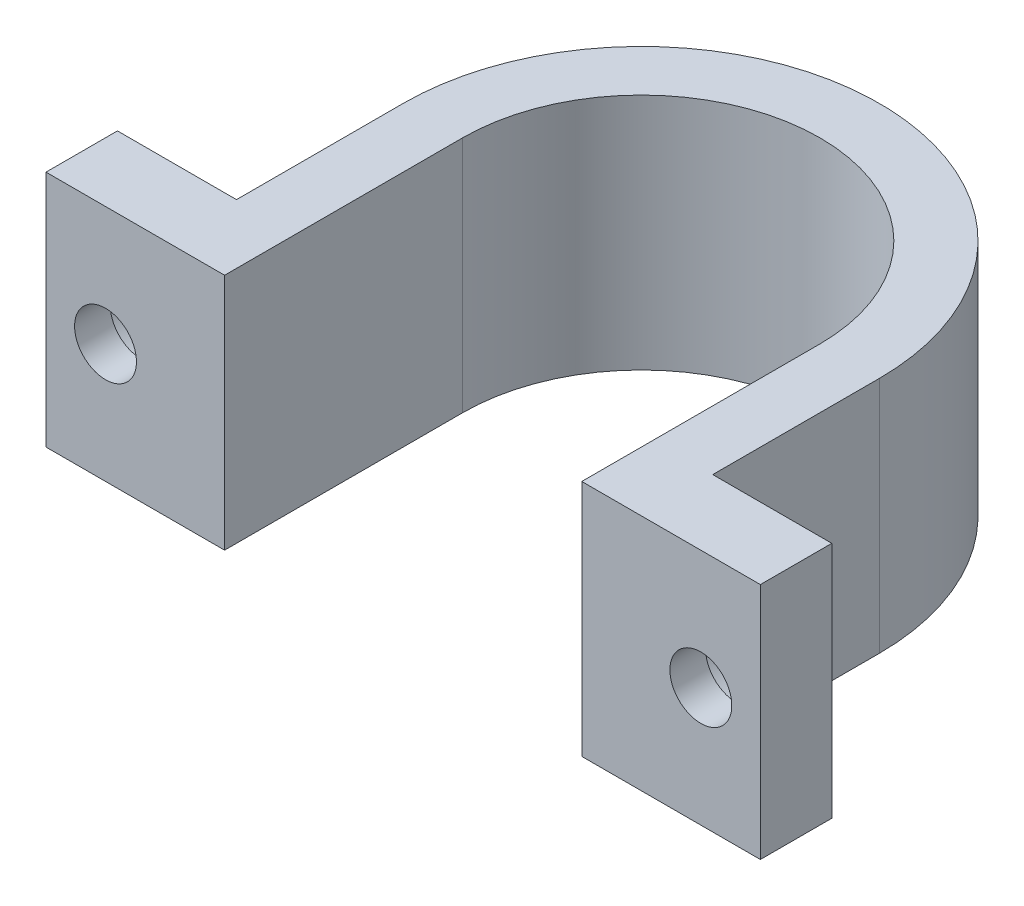
ISO-10303-21;
HEADER;
FILE_DESCRIPTION(('STEP AP214'),'2;1');
FILE_NAME('part.step','',(''),(''),'','','');
FILE_SCHEMA(('AUTOMOTIVE_DESIGN { 1 0 10303 214 1 1 1 1 }'));
ENDSEC;
DATA;
#1=APPLICATION_CONTEXT('core data for automotive mechanical design processes');
#2=APPLICATION_PROTOCOL_DEFINITION('international standard','automotive_design',2000,#1);
#3=PRODUCT_CONTEXT('',#1,'mechanical');
#4=PRODUCT('Part','Part','',(#3));
#5=PRODUCT_RELATED_PRODUCT_CATEGORY('part','',(#4));
#6=PRODUCT_DEFINITION_FORMATION('','',#4);
#7=PRODUCT_DEFINITION_CONTEXT('part definition',#1,'design');
#8=PRODUCT_DEFINITION('design','',#6,#7);
#9=PRODUCT_DEFINITION_SHAPE('','',#8);
#10=(LENGTH_UNIT() NAMED_UNIT(*) SI_UNIT(.MILLI.,.METRE.));
#11=(NAMED_UNIT(*) PLANE_ANGLE_UNIT() SI_UNIT($,.RADIAN.));
#12=(NAMED_UNIT(*) SI_UNIT($,.STERADIAN.) SOLID_ANGLE_UNIT());
#13=UNCERTAINTY_MEASURE_WITH_UNIT(LENGTH_MEASURE(1.E-05),#10,'distance_accuracy_value','');
#14=(GEOMETRIC_REPRESENTATION_CONTEXT(3) GLOBAL_UNCERTAINTY_ASSIGNED_CONTEXT((#13)) GLOBAL_UNIT_ASSIGNED_CONTEXT((#10,
#11,#12)) REPRESENTATION_CONTEXT('',''));
#15=CARTESIAN_POINT('',(0.,0.,0.));
#16=DIRECTION('',(0.,0.,1.));
#17=DIRECTION('',(1.,0.,0.));
#18=AXIS2_PLACEMENT_3D('',#15,#16,#17);
#19=CARTESIAN_POINT('',(-25.,10.,14.));
#20=DIRECTION('',(0.,0.,-1.));
#21=DIRECTION('',(-1.,0.,0.));
#22=AXIS2_PLACEMENT_3D('',#19,#20,#21);
#23=CYLINDRICAL_SURFACE('',#22,2.6);
#24=CARTESIAN_POINT('',(-25.,10.,0.));
#25=DIRECTION('',(0.,0.,-1.));
#26=DIRECTION('',(-1.,0.,0.));
#27=AXIS2_PLACEMENT_3D('',#24,#25,#26);
#28=CIRCLE('',#27,2.6);
#29=CARTESIAN_POINT('',(-27.6,10.,0.));
#30=VERTEX_POINT('',#29);
#31=EDGE_CURVE('E237',#30,#30,#28,.T.);
#32=ORIENTED_EDGE('',*,*,#31,.F.);
#33=EDGE_LOOP('',(#32));
#34=FACE_BOUND('',#33,.T.);
#35=CARTESIAN_POINT('',(-25.,10.,-3.));
#36=DIRECTION('',(0.,0.,-1.));
#37=DIRECTION('',(-1.,0.,0.));
#38=AXIS2_PLACEMENT_3D('',#35,#36,#37);
#39=CIRCLE('',#38,2.6);
#40=CARTESIAN_POINT('',(-27.6,10.,-3.));
#41=VERTEX_POINT('',#40);
#42=EDGE_CURVE('E43',#41,#41,#39,.F.);
#43=ORIENTED_EDGE('',*,*,#42,.F.);
#44=EDGE_LOOP('',(#43));
#45=FACE_BOUND('',#44,.T.);
#46=ADVANCED_FACE('F39',(#34,#45),#23,.F.);
#47=CARTESIAN_POINT('',(25.,10.,14.));
#48=DIRECTION('',(0.,0.,-1.));
#49=DIRECTION('',(-1.,0.,0.));
#50=AXIS2_PLACEMENT_3D('',#47,#48,#49);
#51=CYLINDRICAL_SURFACE('',#50,2.6);
#52=CARTESIAN_POINT('',(25.,10.,0.));
#53=DIRECTION('',(0.,0.,-1.));
#54=DIRECTION('',(-1.,0.,0.));
#55=AXIS2_PLACEMENT_3D('',#52,#53,#54);
#56=CIRCLE('',#55,2.6);
#57=CARTESIAN_POINT('',(22.4,10.,0.));
#58=VERTEX_POINT('',#57);
#59=EDGE_CURVE('E172',#58,#58,#56,.T.);
#60=ORIENTED_EDGE('',*,*,#59,.F.);
#61=EDGE_LOOP('',(#60));
#62=FACE_BOUND('',#61,.T.);
#63=CARTESIAN_POINT('',(25.,10.,-3.));
#64=DIRECTION('',(0.,0.,-1.));
#65=DIRECTION('',(-1.,0.,0.));
#66=AXIS2_PLACEMENT_3D('',#63,#64,#65);
#67=CIRCLE('',#66,2.6);
#68=CARTESIAN_POINT('',(22.4,10.,-3.));
#69=VERTEX_POINT('',#68);
#70=EDGE_CURVE('E240',#69,#69,#67,.F.);
#71=ORIENTED_EDGE('',*,*,#70,.F.);
#72=EDGE_LOOP('',(#71));
#73=FACE_BOUND('',#72,.T.);
#74=ADVANCED_FACE('F319',(#62,#73),#51,.F.);
#75=CARTESIAN_POINT('',(0.,20.,-20.));
#76=DIRECTION('',(0.,-1.,0.));
#77=DIRECTION('',(0.,0.,-1.));
#78=AXIS2_PLACEMENT_3D('',#75,#76,#77);
#79=CYLINDRICAL_SURFACE('',#78,15.);
#80=CARTESIAN_POINT('',(0.,0.,-20.));
#81=DIRECTION('',(0.,-1.,0.));
#82=DIRECTION('',(0.,0.,-1.));
#83=AXIS2_PLACEMENT_3D('',#80,#81,#82);
#84=CIRCLE('',#83,15.);
#85=CARTESIAN_POINT('',(-15.,0.,-20.));
#86=VERTEX_POINT('',#85);
#87=CARTESIAN_POINT('',(15.,0.,-20.));
#88=VERTEX_POINT('',#87);
#89=EDGE_CURVE('E167',#86,#88,#84,.T.);
#90=ORIENTED_EDGE('',*,*,#89,.T.);
#91=DIRECTION('',(0.,-1.,0.));
#92=VECTOR('',#91,1.);
#93=CARTESIAN_POINT('',(15.,20.,-20.));
#94=LINE('',#93,#92);
#95=CARTESIAN_POINT('',(15.,20.,-20.));
#96=VERTEX_POINT('',#95);
#97=EDGE_CURVE('E11',#96,#88,#94,.T.);
#98=ORIENTED_EDGE('',*,*,#97,.F.);
#99=CARTESIAN_POINT('',(0.,20.,-20.));
#100=DIRECTION('',(0.,-1.,0.));
#101=DIRECTION('',(0.,0.,-1.));
#102=AXIS2_PLACEMENT_3D('',#99,#100,#101);
#103=CIRCLE('',#102,15.);
#104=CARTESIAN_POINT('',(-15.,20.,-20.));
#105=VERTEX_POINT('',#104);
#106=EDGE_CURVE('E203',#105,#96,#103,.T.);
#107=ORIENTED_EDGE('',*,*,#106,.F.);
#108=DIRECTION('',(0.,-1.,0.));
#109=VECTOR('',#108,1.);
#110=CARTESIAN_POINT('',(-15.,20.,-20.));
#111=LINE('',#110,#109);
#112=EDGE_CURVE('E163',#105,#86,#111,.T.);
#113=ORIENTED_EDGE('',*,*,#112,.T.);
#114=EDGE_LOOP('',(#90,#98,#107,#113));
#115=FACE_BOUND('',#114,.T.);
#116=ADVANCED_FACE('F41',(#115),#79,.F.);
#117=CARTESIAN_POINT('',(15.,20.,-20.));
#118=DIRECTION('',(1.,0.,0.));
#119=DIRECTION('',(0.,0.,-1.));
#120=AXIS2_PLACEMENT_3D('',#117,#118,#119);
#121=PLANE('',#120);
#122=DIRECTION('',(0.,0.,1.));
#123=VECTOR('',#122,1.);
#124=CARTESIAN_POINT('',(15.,0.,-20.));
#125=LINE('',#124,#123);
#126=CARTESIAN_POINT('',(15.,0.,0.));
#127=VERTEX_POINT('',#126);
#128=EDGE_CURVE('E171',#88,#127,#125,.T.);
#129=ORIENTED_EDGE('',*,*,#128,.T.);
#130=DIRECTION('',(0.,-1.,0.));
#131=VECTOR('',#130,1.);
#132=CARTESIAN_POINT('',(15.,20.,0.));
#133=LINE('',#132,#131);
#134=CARTESIAN_POINT('',(15.,20.,0.));
#135=VERTEX_POINT('',#134);
#136=EDGE_CURVE('E50',#135,#127,#133,.T.);
#137=ORIENTED_EDGE('',*,*,#136,.F.);
#138=DIRECTION('',(0.,0.,1.));
#139=VECTOR('',#138,1.);
#140=CARTESIAN_POINT('',(15.,20.,-20.));
#141=LINE('',#140,#139);
#142=EDGE_CURVE('E113',#96,#135,#141,.T.);
#143=ORIENTED_EDGE('',*,*,#142,.F.);
#144=ORIENTED_EDGE('',*,*,#97,.T.);
#145=EDGE_LOOP('',(#129,#137,#143,#144));
#146=FACE_BOUND('',#145,.T.);
#147=ADVANCED_FACE('F384',(#146),#121,.F.);
#148=CARTESIAN_POINT('',(20.,20.,0.));
#149=DIRECTION('',(0.,0.,-1.));
#150=DIRECTION('',(-1.,0.,0.));
#151=AXIS2_PLACEMENT_3D('',#148,#149,#150);
#152=PLANE('',#151);
#153=ORIENTED_EDGE('',*,*,#59,.T.);
#154=EDGE_LOOP('',(#153));
#155=FACE_BOUND('',#154,.T.);
#156=DIRECTION('',(1.,0.,0.));
#157=VECTOR('',#156,1.);
#158=CARTESIAN_POINT('',(20.,0.,0.));
#159=LINE('',#158,#157);
#160=CARTESIAN_POINT('',(30.,0.,0.));
#161=VERTEX_POINT('',#160);
#162=EDGE_CURVE('E176',#127,#161,#159,.T.);
#163=ORIENTED_EDGE('',*,*,#162,.T.);
#164=DIRECTION('',(0.,-1.,0.));
#165=VECTOR('',#164,1.);
#166=CARTESIAN_POINT('',(30.,20.,0.));
#167=LINE('',#166,#165);
#168=CARTESIAN_POINT('',(30.,20.,0.));
#169=VERTEX_POINT('',#168);
#170=EDGE_CURVE('E230',#169,#161,#167,.T.);
#171=ORIENTED_EDGE('',*,*,#170,.F.);
#172=DIRECTION('',(1.,0.,0.));
#173=VECTOR('',#172,1.);
#174=CARTESIAN_POINT('',(15.,20.,0.));
#175=LINE('',#174,#173);
#176=EDGE_CURVE('E273',#135,#169,#175,.T.);
#177=ORIENTED_EDGE('',*,*,#176,.F.);
#178=ORIENTED_EDGE('',*,*,#136,.T.);
#179=EDGE_LOOP('',(#163,#171,#177,#178));
#180=FACE_BOUND('',#179,.T.);
#181=ADVANCED_FACE('F381',(#155,#180),#152,.F.);
#182=CARTESIAN_POINT('',(30.,20.,0.));
#183=DIRECTION('',(-1.,0.,0.));
#184=DIRECTION('',(0.,0.,1.));
#185=AXIS2_PLACEMENT_3D('',#182,#183,#184);
#186=PLANE('',#185);
#187=DIRECTION('',(0.,0.,-1.));
#188=VECTOR('',#187,1.);
#189=CARTESIAN_POINT('',(30.,0.,0.));
#190=LINE('',#189,#188);
#191=CARTESIAN_POINT('',(30.,0.,-6.));
#192=VERTEX_POINT('',#191);
#193=EDGE_CURVE('E179',#161,#192,#190,.T.);
#194=ORIENTED_EDGE('',*,*,#193,.T.);
#195=DIRECTION('',(0.,-1.,0.));
#196=VECTOR('',#195,1.);
#197=CARTESIAN_POINT('',(30.,20.,-6.));
#198=LINE('',#197,#196);
#199=CARTESIAN_POINT('',(30.,20.,-6.));
#200=VERTEX_POINT('',#199);
#201=EDGE_CURVE('E226',#200,#192,#198,.T.);
#202=ORIENTED_EDGE('',*,*,#201,.F.);
#203=DIRECTION('',(0.,0.,-1.));
#204=VECTOR('',#203,1.);
#205=CARTESIAN_POINT('',(30.,20.,0.));
#206=LINE('',#205,#204);
#207=EDGE_CURVE('E276',#169,#200,#206,.T.);
#208=ORIENTED_EDGE('',*,*,#207,.F.);
#209=ORIENTED_EDGE('',*,*,#170,.T.);
#210=EDGE_LOOP('',(#194,#202,#208,#209));
#211=FACE_BOUND('',#210,.T.);
#212=ADVANCED_FACE('F377',(#211),#186,.F.);
#213=CARTESIAN_POINT('',(30.,20.,-6.));
#214=DIRECTION('',(0.,0.,1.));
#215=DIRECTION('',(1.,0.,0.));
#216=AXIS2_PLACEMENT_3D('',#213,#214,#215);
#217=PLANE('',#216);
#218=CARTESIAN_POINT('',(25.,10.,-6.));
#219=DIRECTION('',(0.,0.,-1.));
#220=DIRECTION('',(-1.,0.,0.));
#221=AXIS2_PLACEMENT_3D('',#218,#219,#220);
#222=CIRCLE('',#221,4.9);
#223=CARTESIAN_POINT('',(20.1,10.,-6.));
#224=VERTEX_POINT('',#223);
#225=EDGE_CURVE('E250',#224,#224,#222,.T.);
#226=ORIENTED_EDGE('',*,*,#225,.F.);
#227=EDGE_LOOP('',(#226));
#228=FACE_BOUND('',#227,.T.);
#229=DIRECTION('',(-1.,0.,0.));
#230=VECTOR('',#229,1.);
#231=CARTESIAN_POINT('',(30.,0.,-6.));
#232=LINE('',#231,#230);
#233=CARTESIAN_POINT('',(20.,0.,-6.));
#234=VERTEX_POINT('',#233);
#235=EDGE_CURVE('E182',#192,#234,#232,.T.);
#236=ORIENTED_EDGE('',*,*,#235,.T.);
#237=DIRECTION('',(0.,-1.,0.));
#238=VECTOR('',#237,1.);
#239=CARTESIAN_POINT('',(20.,20.,-6.));
#240=LINE('',#239,#238);
#241=CARTESIAN_POINT('',(20.,20.,-6.));
#242=VERTEX_POINT('',#241);
#243=EDGE_CURVE('E222',#242,#234,#240,.T.);
#244=ORIENTED_EDGE('',*,*,#243,.F.);
#245=DIRECTION('',(-1.,0.,0.));
#246=VECTOR('',#245,1.);
#247=CARTESIAN_POINT('',(30.,20.,-6.));
#248=LINE('',#247,#246);
#249=EDGE_CURVE('E279',#200,#242,#248,.T.);
#250=ORIENTED_EDGE('',*,*,#249,.F.);
#251=ORIENTED_EDGE('',*,*,#201,.T.);
#252=EDGE_LOOP('',(#236,#244,#250,#251));
#253=FACE_BOUND('',#252,.T.);
#254=ADVANCED_FACE('F373',(#228,#253),#217,.F.);
#255=CARTESIAN_POINT('',(20.,20.,-6.));
#256=DIRECTION('',(-1.,0.,0.));
#257=DIRECTION('',(0.,0.,1.));
#258=AXIS2_PLACEMENT_3D('',#255,#256,#257);
#259=PLANE('',#258);
#260=DIRECTION('',(0.,0.,-1.));
#261=VECTOR('',#260,1.);
#262=CARTESIAN_POINT('',(20.,0.,-6.));
#263=LINE('',#262,#261);
#264=CARTESIAN_POINT('',(20.,0.,-20.));
#265=VERTEX_POINT('',#264);
#266=EDGE_CURVE('E185',#234,#265,#263,.T.);
#267=ORIENTED_EDGE('',*,*,#266,.T.);
#268=DIRECTION('',(0.,-1.,0.));
#269=VECTOR('',#268,1.);
#270=CARTESIAN_POINT('',(20.,20.,-20.));
#271=LINE('',#270,#269);
#272=CARTESIAN_POINT('',(20.,20.,-20.));
#273=VERTEX_POINT('',#272);
#274=EDGE_CURVE('E218',#273,#265,#271,.T.);
#275=ORIENTED_EDGE('',*,*,#274,.F.);
#276=DIRECTION('',(0.,0.,-1.));
#277=VECTOR('',#276,1.);
#278=CARTESIAN_POINT('',(20.,20.,-6.));
#279=LINE('',#278,#277);
#280=EDGE_CURVE('E282',#242,#273,#279,.T.);
#281=ORIENTED_EDGE('',*,*,#280,.F.);
#282=ORIENTED_EDGE('',*,*,#243,.T.);
#283=EDGE_LOOP('',(#267,#275,#281,#282));
#284=FACE_BOUND('',#283,.T.);
#285=ADVANCED_FACE('F369',(#284),#259,.F.);
#286=CARTESIAN_POINT('',(0.,20.,-20.));
#287=DIRECTION('',(0.,-1.,0.));
#288=DIRECTION('',(0.,0.,-1.));
#289=AXIS2_PLACEMENT_3D('',#286,#287,#288);
#290=CYLINDRICAL_SURFACE('',#289,20.);
#291=CARTESIAN_POINT('',(0.,0.,-20.));
#292=DIRECTION('',(0.,1.,0.));
#293=DIRECTION('',(0.,0.,-1.));
#294=AXIS2_PLACEMENT_3D('',#291,#292,#293);
#295=CIRCLE('',#294,20.);
#296=CARTESIAN_POINT('',(-20.,0.,-20.));
#297=VERTEX_POINT('',#296);
#298=EDGE_CURVE('E188',#265,#297,#295,.T.);
#299=ORIENTED_EDGE('',*,*,#298,.T.);
#300=DIRECTION('',(0.,-1.,0.));
#301=VECTOR('',#300,1.);
#302=CARTESIAN_POINT('',(-20.,20.,-20.));
#303=LINE('',#302,#301);
#304=CARTESIAN_POINT('',(-20.,20.,-20.));
#305=VERTEX_POINT('',#304);
#306=EDGE_CURVE('E214',#305,#297,#303,.T.);
#307=ORIENTED_EDGE('',*,*,#306,.F.);
#308=CARTESIAN_POINT('',(0.,20.,-20.));
#309=DIRECTION('',(0.,1.,0.));
#310=DIRECTION('',(0.,0.,-1.));
#311=AXIS2_PLACEMENT_3D('',#308,#309,#310);
#312=CIRCLE('',#311,20.);
#313=EDGE_CURVE('E285',#273,#305,#312,.T.);
#314=ORIENTED_EDGE('',*,*,#313,.F.);
#315=ORIENTED_EDGE('',*,*,#274,.T.);
#316=EDGE_LOOP('',(#299,#307,#314,#315));
#317=FACE_BOUND('',#316,.T.);
#318=ADVANCED_FACE('F364',(#317),#290,.T.);
#319=CARTESIAN_POINT('',(-20.,20.,-6.));
#320=DIRECTION('',(1.,0.,0.));
#321=DIRECTION('',(0.,0.,-1.));
#322=AXIS2_PLACEMENT_3D('',#319,#320,#321);
#323=PLANE('',#322);
#324=DIRECTION('',(0.,0.,1.));
#325=VECTOR('',#324,1.);
#326=CARTESIAN_POINT('',(-20.,0.,-6.));
#327=LINE('',#326,#325);
#328=CARTESIAN_POINT('',(-20.,0.,-6.));
#329=VERTEX_POINT('',#328);
#330=EDGE_CURVE('E191',#297,#329,#327,.T.);
#331=ORIENTED_EDGE('',*,*,#330,.T.);
#332=DIRECTION('',(0.,-1.,0.));
#333=VECTOR('',#332,1.);
#334=CARTESIAN_POINT('',(-20.,20.,-6.));
#335=LINE('',#334,#333);
#336=CARTESIAN_POINT('',(-20.,20.,-6.));
#337=VERTEX_POINT('',#336);
#338=EDGE_CURVE('E210',#337,#329,#335,.T.);
#339=ORIENTED_EDGE('',*,*,#338,.F.);
#340=DIRECTION('',(0.,0.,1.));
#341=VECTOR('',#340,1.);
#342=CARTESIAN_POINT('',(-20.,20.,-6.));
#343=LINE('',#342,#341);
#344=EDGE_CURVE('E288',#305,#337,#343,.T.);
#345=ORIENTED_EDGE('',*,*,#344,.F.);
#346=ORIENTED_EDGE('',*,*,#306,.T.);
#347=EDGE_LOOP('',(#331,#339,#345,#346));
#348=FACE_BOUND('',#347,.T.);
#349=ADVANCED_FACE('F296',(#348),#323,.F.);
#350=CARTESIAN_POINT('',(-30.,20.,-6.));
#351=DIRECTION('',(0.,0.,1.));
#352=DIRECTION('',(1.,0.,0.));
#353=AXIS2_PLACEMENT_3D('',#350,#351,#352);
#354=PLANE('',#353);
#355=CARTESIAN_POINT('',(-25.,10.,-6.));
#356=DIRECTION('',(0.,0.,-1.));
#357=DIRECTION('',(-1.,0.,0.));
#358=AXIS2_PLACEMENT_3D('',#355,#356,#357);
#359=CIRCLE('',#358,4.9);
#360=CARTESIAN_POINT('',(-29.9,10.,-6.));
#361=VERTEX_POINT('',#360);
#362=EDGE_CURVE('E262',#361,#361,#359,.T.);
#363=ORIENTED_EDGE('',*,*,#362,.F.);
#364=EDGE_LOOP('',(#363));
#365=FACE_BOUND('',#364,.T.);
#366=DIRECTION('',(-1.,0.,0.));
#367=VECTOR('',#366,1.);
#368=CARTESIAN_POINT('',(-30.,0.,-6.));
#369=LINE('',#368,#367);
#370=CARTESIAN_POINT('',(-30.,0.,-6.));
#371=VERTEX_POINT('',#370);
#372=EDGE_CURVE('E194',#329,#371,#369,.T.);
#373=ORIENTED_EDGE('',*,*,#372,.T.);
#374=DIRECTION('',(0.,-1.,0.));
#375=VECTOR('',#374,1.);
#376=CARTESIAN_POINT('',(-30.,20.,-6.));
#377=LINE('',#376,#375);
#378=CARTESIAN_POINT('',(-30.,20.,-6.));
#379=VERTEX_POINT('',#378);
#380=EDGE_CURVE('E156',#379,#371,#377,.T.);
#381=ORIENTED_EDGE('',*,*,#380,.F.);
#382=DIRECTION('',(-1.,0.,0.));
#383=VECTOR('',#382,1.);
#384=CARTESIAN_POINT('',(-30.,20.,-6.));
#385=LINE('',#384,#383);
#386=EDGE_CURVE('E144',#337,#379,#385,.T.);
#387=ORIENTED_EDGE('',*,*,#386,.F.);
#388=ORIENTED_EDGE('',*,*,#338,.T.);
#389=EDGE_LOOP('',(#373,#381,#387,#388));
#390=FACE_BOUND('',#389,.T.);
#391=ADVANCED_FACE('F300',(#365,#390),#354,.F.);
#392=CARTESIAN_POINT('',(-30.,20.,0.));
#393=DIRECTION('',(1.,0.,0.));
#394=DIRECTION('',(0.,0.,-1.));
#395=AXIS2_PLACEMENT_3D('',#392,#393,#394);
#396=PLANE('',#395);
#397=DIRECTION('',(0.,0.,1.));
#398=VECTOR('',#397,1.);
#399=CARTESIAN_POINT('',(-30.,0.,0.));
#400=LINE('',#399,#398);
#401=CARTESIAN_POINT('',(-30.,0.,0.));
#402=VERTEX_POINT('',#401);
#403=EDGE_CURVE('E154',#371,#402,#400,.T.);
#404=ORIENTED_EDGE('',*,*,#403,.T.);
#405=DIRECTION('',(0.,-1.,0.));
#406=VECTOR('',#405,1.);
#407=CARTESIAN_POINT('',(-30.,20.,0.));
#408=LINE('',#407,#406);
#409=CARTESIAN_POINT('',(-30.,20.,0.));
#410=VERTEX_POINT('',#409);
#411=EDGE_CURVE('E151',#410,#402,#408,.T.);
#412=ORIENTED_EDGE('',*,*,#411,.F.);
#413=DIRECTION('',(0.,0.,1.));
#414=VECTOR('',#413,1.);
#415=CARTESIAN_POINT('',(-30.,20.,0.));
#416=LINE('',#415,#414);
#417=EDGE_CURVE('E138',#379,#410,#416,.T.);
#418=ORIENTED_EDGE('',*,*,#417,.F.);
#419=ORIENTED_EDGE('',*,*,#380,.T.);
#420=EDGE_LOOP('',(#404,#412,#418,#419));
#421=FACE_BOUND('',#420,.T.);
#422=ADVANCED_FACE('F152',(#421),#396,.F.);
#423=CARTESIAN_POINT('',(-15.,20.,0.));
#424=DIRECTION('',(0.,0.,-1.));
#425=DIRECTION('',(-1.,0.,0.));
#426=AXIS2_PLACEMENT_3D('',#423,#424,#425);
#427=PLANE('',#426);
#428=ORIENTED_EDGE('',*,*,#31,.T.);
#429=EDGE_LOOP('',(#428));
#430=FACE_BOUND('',#429,.T.);
#431=DIRECTION('',(1.,0.,0.));
#432=VECTOR('',#431,1.);
#433=CARTESIAN_POINT('',(-15.,0.,0.));
#434=LINE('',#433,#432);
#435=CARTESIAN_POINT('',(-15.,0.,0.));
#436=VERTEX_POINT('',#435);
#437=EDGE_CURVE('E99',#402,#436,#434,.T.);
#438=ORIENTED_EDGE('',*,*,#437,.T.);
#439=DIRECTION('',(0.,-1.,0.));
#440=VECTOR('',#439,1.);
#441=CARTESIAN_POINT('',(-15.,20.,0.));
#442=LINE('',#441,#440);
#443=CARTESIAN_POINT('',(-15.,20.,0.));
#444=VERTEX_POINT('',#443);
#445=EDGE_CURVE('E157',#444,#436,#442,.T.);
#446=ORIENTED_EDGE('',*,*,#445,.F.);
#447=DIRECTION('',(1.,0.,0.));
#448=VECTOR('',#447,1.);
#449=CARTESIAN_POINT('',(-20.,20.,0.));
#450=LINE('',#449,#448);
#451=EDGE_CURVE('E142',#410,#444,#450,.T.);
#452=ORIENTED_EDGE('',*,*,#451,.F.);
#453=ORIENTED_EDGE('',*,*,#411,.T.);
#454=EDGE_LOOP('',(#438,#446,#452,#453));
#455=FACE_BOUND('',#454,.T.);
#456=ADVANCED_FACE('F159',(#430,#455),#427,.F.);
#457=CARTESIAN_POINT('',(-15.,20.,-20.));
#458=DIRECTION('',(-1.,0.,0.));
#459=DIRECTION('',(0.,0.,1.));
#460=AXIS2_PLACEMENT_3D('',#457,#458,#459);
#461=PLANE('',#460);
#462=DIRECTION('',(0.,0.,-1.));
#463=VECTOR('',#462,1.);
#464=CARTESIAN_POINT('',(-15.,0.,-20.));
#465=LINE('',#464,#463);
#466=EDGE_CURVE('E105',#436,#86,#465,.T.);
#467=ORIENTED_EDGE('',*,*,#466,.T.);
#468=ORIENTED_EDGE('',*,*,#112,.F.);
#469=DIRECTION('',(0.,0.,-1.));
#470=VECTOR('',#469,1.);
#471=CARTESIAN_POINT('',(-15.,20.,-20.));
#472=LINE('',#471,#470);
#473=EDGE_CURVE('E59',#444,#105,#472,.T.);
#474=ORIENTED_EDGE('',*,*,#473,.F.);
#475=ORIENTED_EDGE('',*,*,#445,.T.);
#476=EDGE_LOOP('',(#467,#468,#474,#475));
#477=FACE_BOUND('',#476,.T.);
#478=ADVANCED_FACE('F307',(#477),#461,.F.);
#479=CARTESIAN_POINT('',(0.,20.,-20.));
#480=DIRECTION('',(0.,-1.,0.));
#481=DIRECTION('',(0.,0.,-1.));
#482=AXIS2_PLACEMENT_3D('',#479,#480,#481);
#483=PLANE('',#482);
#484=ORIENTED_EDGE('',*,*,#106,.T.);
#485=ORIENTED_EDGE('',*,*,#142,.T.);
#486=ORIENTED_EDGE('',*,*,#176,.T.);
#487=ORIENTED_EDGE('',*,*,#207,.T.);
#488=ORIENTED_EDGE('',*,*,#249,.T.);
#489=ORIENTED_EDGE('',*,*,#280,.T.);
#490=ORIENTED_EDGE('',*,*,#313,.T.);
#491=ORIENTED_EDGE('',*,*,#344,.T.);
#492=ORIENTED_EDGE('',*,*,#386,.T.);
#493=ORIENTED_EDGE('',*,*,#417,.T.);
#494=ORIENTED_EDGE('',*,*,#451,.T.);
#495=ORIENTED_EDGE('',*,*,#473,.T.);
#496=EDGE_LOOP('',(#484,#485,#486,#487,#488,#489,#490,#491,#492,#493,#494,#495));
#497=FACE_BOUND('',#496,.T.);
#498=ADVANCED_FACE('F140',(#497),#483,.F.);
#499=CARTESIAN_POINT('',(0.,0.,-20.));
#500=DIRECTION('',(0.,-1.,0.));
#501=DIRECTION('',(0.,0.,-1.));
#502=AXIS2_PLACEMENT_3D('',#499,#500,#501);
#503=PLANE('',#502);
#504=ORIENTED_EDGE('',*,*,#89,.F.);
#505=ORIENTED_EDGE('',*,*,#466,.F.);
#506=ORIENTED_EDGE('',*,*,#437,.F.);
#507=ORIENTED_EDGE('',*,*,#403,.F.);
#508=ORIENTED_EDGE('',*,*,#372,.F.);
#509=ORIENTED_EDGE('',*,*,#330,.F.);
#510=ORIENTED_EDGE('',*,*,#298,.F.);
#511=ORIENTED_EDGE('',*,*,#266,.F.);
#512=ORIENTED_EDGE('',*,*,#235,.F.);
#513=ORIENTED_EDGE('',*,*,#193,.F.);
#514=ORIENTED_EDGE('',*,*,#162,.F.);
#515=ORIENTED_EDGE('',*,*,#128,.F.);
#516=EDGE_LOOP('',(#504,#505,#506,#507,#508,#509,#510,#511,#512,#513,#514,#515));
#517=FACE_BOUND('',#516,.T.);
#518=ADVANCED_FACE('F303',(#517),#503,.T.);
#519=CARTESIAN_POINT('',(25.,10.,-3.));
#520=DIRECTION('',(0.,0.,-1.));
#521=DIRECTION('',(-1.,0.,0.));
#522=AXIS2_PLACEMENT_3D('',#519,#520,#521);
#523=PLANE('',#522);
#524=CARTESIAN_POINT('',(25.,10.,-3.));
#525=DIRECTION('',(0.,0.,-1.));
#526=DIRECTION('',(-1.,0.,0.));
#527=AXIS2_PLACEMENT_3D('',#524,#525,#526);
#528=CIRCLE('',#527,4.9);
#529=CARTESIAN_POINT('',(20.1,10.,-3.));
#530=VERTEX_POINT('',#529);
#531=EDGE_CURVE('E243',#530,#530,#528,.T.);
#532=ORIENTED_EDGE('',*,*,#531,.T.);
#533=EDGE_LOOP('',(#532));
#534=FACE_BOUND('',#533,.T.);
#535=ORIENTED_EDGE('',*,*,#70,.T.);
#536=EDGE_LOOP('',(#535));
#537=FACE_BOUND('',#536,.T.);
#538=ADVANCED_FACE('F333',(#534,#537),#523,.T.);
#539=CARTESIAN_POINT('',(25.,10.,-3.));
#540=DIRECTION('',(0.,0.,-1.));
#541=DIRECTION('',(-1.,0.,0.));
#542=AXIS2_PLACEMENT_3D('',#539,#540,#541);
#543=CYLINDRICAL_SURFACE('',#542,4.9);
#544=ORIENTED_EDGE('',*,*,#531,.F.);
#545=EDGE_LOOP('',(#544));
#546=FACE_BOUND('',#545,.T.);
#547=ORIENTED_EDGE('',*,*,#225,.T.);
#548=EDGE_LOOP('',(#547));
#549=FACE_BOUND('',#548,.T.);
#550=ADVANCED_FACE('F337',(#546,#549),#543,.F.);
#551=CARTESIAN_POINT('',(-25.,10.,-3.));
#552=DIRECTION('',(0.,0.,-1.));
#553=DIRECTION('',(-1.,0.,0.));
#554=AXIS2_PLACEMENT_3D('',#551,#552,#553);
#555=PLANE('',#554);
#556=CARTESIAN_POINT('',(-25.,10.,-3.));
#557=DIRECTION('',(0.,0.,-1.));
#558=DIRECTION('',(-1.,0.,0.));
#559=AXIS2_PLACEMENT_3D('',#556,#557,#558);
#560=CIRCLE('',#559,4.9);
#561=CARTESIAN_POINT('',(-29.9,10.,-3.));
#562=VERTEX_POINT('',#561);
#563=EDGE_CURVE('E256',#562,#562,#560,.T.);
#564=ORIENTED_EDGE('',*,*,#563,.T.);
#565=EDGE_LOOP('',(#564));
#566=FACE_BOUND('',#565,.T.);
#567=ORIENTED_EDGE('',*,*,#42,.T.);
#568=EDGE_LOOP('',(#567));
#569=FACE_BOUND('',#568,.T.);
#570=ADVANCED_FACE('F342',(#566,#569),#555,.T.);
#571=CARTESIAN_POINT('',(-25.,10.,-3.));
#572=DIRECTION('',(0.,0.,-1.));
#573=DIRECTION('',(-1.,0.,0.));
#574=AXIS2_PLACEMENT_3D('',#571,#572,#573);
#575=CYLINDRICAL_SURFACE('',#574,4.9);
#576=ORIENTED_EDGE('',*,*,#563,.F.);
#577=EDGE_LOOP('',(#576));
#578=FACE_BOUND('',#577,.T.);
#579=ORIENTED_EDGE('',*,*,#362,.T.);
#580=EDGE_LOOP('',(#579));
#581=FACE_BOUND('',#580,.T.);
#582=ADVANCED_FACE('F330',(#578,#581),#575,.F.);
#583=CLOSED_SHELL('',(#46,#74,#116,#147,#181,#212,#254,#285,#318,#349,#391,#422,#456,#478,#498,
#518,#538,#550,#570,#582));
#584=MANIFOLD_SOLID_BREP('B2',#583);
#585=ADVANCED_BREP_SHAPE_REPRESENTATION('',(#18,#584),#14);
#586=SHAPE_DEFINITION_REPRESENTATION(#9,#585);
ENDSEC;
END-ISO-10303-21;
